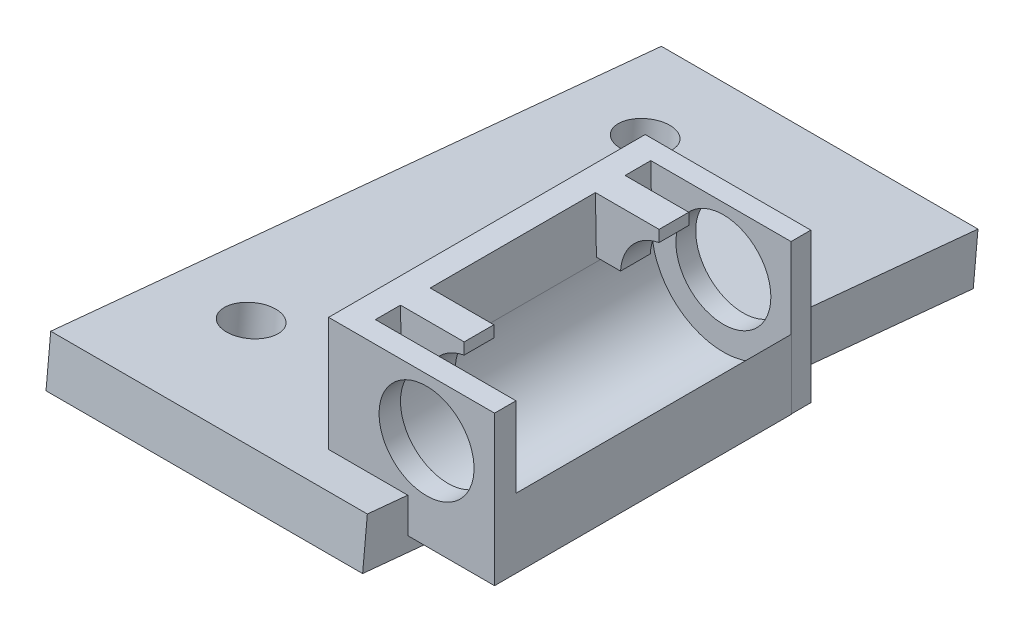
ISO-10303-21;
HEADER;
FILE_DESCRIPTION(('STEP AP214'),'2;1');
FILE_NAME('part.step','',(''),(''),'','','');
FILE_SCHEMA(('AUTOMOTIVE_DESIGN { 1 0 10303 214 1 1 1 1 }'));
ENDSEC;
DATA;
#1=APPLICATION_CONTEXT('core data for automotive mechanical design processes');
#2=APPLICATION_PROTOCOL_DEFINITION('international standard','automotive_design',2000,#1);
#3=PRODUCT_CONTEXT('',#1,'mechanical');
#4=PRODUCT('Part','Part','',(#3));
#5=PRODUCT_RELATED_PRODUCT_CATEGORY('part','',(#4));
#6=PRODUCT_DEFINITION_FORMATION('','',#4);
#7=PRODUCT_DEFINITION_CONTEXT('part definition',#1,'design');
#8=PRODUCT_DEFINITION('design','',#6,#7);
#9=PRODUCT_DEFINITION_SHAPE('','',#8);
#10=(LENGTH_UNIT() NAMED_UNIT(*) SI_UNIT(.MILLI.,.METRE.));
#11=(NAMED_UNIT(*) PLANE_ANGLE_UNIT() SI_UNIT($,.RADIAN.));
#12=(NAMED_UNIT(*) SI_UNIT($,.STERADIAN.) SOLID_ANGLE_UNIT());
#13=UNCERTAINTY_MEASURE_WITH_UNIT(LENGTH_MEASURE(1.E-05),#10,'distance_accuracy_value','');
#14=(GEOMETRIC_REPRESENTATION_CONTEXT(3) GLOBAL_UNCERTAINTY_ASSIGNED_CONTEXT((#13)) GLOBAL_UNIT_ASSIGNED_CONTEXT((#10,
#11,#12)) REPRESENTATION_CONTEXT('',''));
#15=CARTESIAN_POINT('',(0.,0.,0.));
#16=DIRECTION('',(0.,0.,1.));
#17=DIRECTION('',(1.,0.,0.));
#18=AXIS2_PLACEMENT_3D('',#15,#16,#17);
#19=CARTESIAN_POINT('',(0.,-0.379856494550895,38.1000000000001));
#20=DIRECTION('',(0.,-1.,0.));
#21=DIRECTION('',(0.,0.,1.));
#22=AXIS2_PLACEMENT_3D('',#19,#20,#21);
#23=PLANE('',#22);
#24=DIRECTION('',(1.,0.,0.));
#25=VECTOR('',#24,1.);
#26=CARTESIAN_POINT('',(-215.570198928087,-0.379856494550895,-2.54));
#27=LINE('',#26,#25);
#28=CARTESIAN_POINT('',(-205.410198928087,-0.379856494550895,-2.54));
#29=VERTEX_POINT('',#28);
#30=CARTESIAN_POINT('',(-194.315789963556,-0.379856494550895,-2.54));
#31=VERTEX_POINT('',#30);
#32=EDGE_CURVE('E384',#29,#31,#27,.T.);
#33=ORIENTED_EDGE('',*,*,#32,.T.);
#34=DIRECTION('',(0.,0.,1.));
#35=VECTOR('',#34,1.);
#36=CARTESIAN_POINT('',(-194.315789963556,-0.379856494550895,-2.54));
#37=LINE('',#36,#35);
#38=CARTESIAN_POINT('',(-194.315789963556,-0.379856494550895,0.));
#39=VERTEX_POINT('',#38);
#40=EDGE_CURVE('E406',#31,#39,#37,.T.);
#41=ORIENTED_EDGE('',*,*,#40,.T.);
#42=DIRECTION('',(1.,0.,0.));
#43=VECTOR('',#42,1.);
#44=CARTESIAN_POINT('',(0.,-0.379856494550895,0.));
#45=LINE('',#44,#43);
#46=CARTESIAN_POINT('',(-194.271100300856,-0.379856494550895,0.));
#47=VERTEX_POINT('',#46);
#48=EDGE_CURVE('E434',#39,#47,#45,.T.);
#49=ORIENTED_EDGE('',*,*,#48,.T.);
#50=DIRECTION('',(0.,0.,-1.));
#51=VECTOR('',#50,1.);
#52=CARTESIAN_POINT('',(-194.271100300856,-0.379856494550895,38.1000000000001));
#53=LINE('',#52,#51);
#54=CARTESIAN_POINT('',(-194.271100300856,-0.379856494550895,38.1000000000001));
#55=VERTEX_POINT('',#54);
#56=EDGE_CURVE('E445',#55,#47,#53,.T.);
#57=ORIENTED_EDGE('',*,*,#56,.F.);
#58=DIRECTION('',(1.,0.,0.));
#59=VECTOR('',#58,1.);
#60=CARTESIAN_POINT('',(0.,-0.379856494550895,38.1000000000001));
#61=LINE('',#60,#59);
#62=CARTESIAN_POINT('',(-205.410198928087,-0.379856494550895,38.1000000000001));
#63=VERTEX_POINT('',#62);
#64=EDGE_CURVE('E418',#63,#55,#61,.T.);
#65=ORIENTED_EDGE('',*,*,#64,.F.);
#66=DIRECTION('',(0.,0.,1.));
#67=VECTOR('',#66,1.);
#68=CARTESIAN_POINT('',(-205.410198928087,-0.379856494550895,38.1));
#69=LINE('',#68,#67);
#70=EDGE_CURVE('E251',#29,#63,#69,.T.);
#71=ORIENTED_EDGE('',*,*,#70,.F.);
#72=EDGE_LOOP('',(#33,#41,#49,#57,#65,#71));
#73=FACE_BOUND('',#72,.T.);
#74=ADVANCED_FACE('F49',(#73),#23,.T.);
#75=CARTESIAN_POINT('',(-203.,11.3497927017428,38.1000000000001));
#76=DIRECTION('',(0.,0.,-1.));
#77=DIRECTION('',(1.,0.,0.));
#78=AXIS2_PLACEMENT_3D('',#75,#76,#77);
#79=CYLINDRICAL_SURFACE('',#78,9.17500000000006);
#80=CARTESIAN_POINT('',(-203.,11.3497927017428,35.3500000000005));
#81=DIRECTION('',(0.,0.,1.));
#82=DIRECTION('',(0.,-1.,0.));
#83=AXIS2_PLACEMENT_3D('',#80,#81,#82);
#84=CIRCLE('',#83,9.17500000000006);
#85=CARTESIAN_POINT('',(-194.271100300856,8.52367610077182,35.3500000000005));
#86=VERTEX_POINT('',#85);
#87=CARTESIAN_POINT('',(-212.173440462279,11.1806327625625,35.3500000000005));
#88=VERTEX_POINT('',#87);
#89=EDGE_CURVE('E359',#86,#88,#84,.F.);
#90=ORIENTED_EDGE('',*,*,#89,.F.);
#91=DIRECTION('',(0.,0.,-1.));
#92=VECTOR('',#91,1.);
#93=CARTESIAN_POINT('',(-194.271100300856,8.52367610077182,38.1000000000001));
#94=LINE('',#93,#92);
#95=CARTESIAN_POINT('',(-194.271100300856,8.52367610077182,0.));
#96=VERTEX_POINT('',#95);
#97=EDGE_CURVE('E440',#86,#96,#94,.T.);
#98=ORIENTED_EDGE('',*,*,#97,.T.);
#99=CARTESIAN_POINT('',(-203.,11.3497927017428,0.));
#100=DIRECTION('',(0.,0.,1.));
#101=DIRECTION('',(1.,0.,0.));
#102=AXIS2_PLACEMENT_3D('',#99,#100,#101);
#103=CIRCLE('',#102,9.17500000000006);
#104=CARTESIAN_POINT('',(-194.315789963556,8.38919799072162,0.));
#105=VERTEX_POINT('',#104);
#106=EDGE_CURVE('E410',#105,#96,#103,.T.);
#107=ORIENTED_EDGE('',*,*,#106,.F.);
#108=CARTESIAN_POINT('',(-212.173440462279,11.1806327625625,0.));
#109=VERTEX_POINT('',#108);
#110=EDGE_CURVE('E427',#109,#105,#103,.T.);
#111=ORIENTED_EDGE('',*,*,#110,.F.);
#112=DIRECTION('',(0.,0.,-1.));
#113=VECTOR('',#112,1.);
#114=CARTESIAN_POINT('',(-212.173440462279,11.1806327625625,38.1000000000001));
#115=LINE('',#114,#113);
#116=EDGE_CURVE('E426',#88,#109,#115,.T.);
#117=ORIENTED_EDGE('',*,*,#116,.F.);
#118=EDGE_LOOP('',(#90,#98,#107,#111,#117));
#119=FACE_BOUND('',#118,.T.);
#120=ADVANCED_FACE('F51',(#119),#79,.F.);
#121=CARTESIAN_POINT('',(-194.271100300856,0.,38.1000000000001));
#122=DIRECTION('',(1.,0.,0.));
#123=DIRECTION('',(0.,0.,1.));
#124=AXIS2_PLACEMENT_3D('',#121,#122,#123);
#125=PLANE('',#124);
#126=DIRECTION('',(0.,1.,0.));
#127=VECTOR('',#126,1.);
#128=CARTESIAN_POINT('',(-194.271100300856,0.,0.));
#129=LINE('',#128,#127);
#130=EDGE_CURVE('E415',#47,#96,#129,.T.);
#131=ORIENTED_EDGE('',*,*,#130,.T.);
#132=ORIENTED_EDGE('',*,*,#97,.F.);
#133=DIRECTION('',(0.,-1.,0.));
#134=VECTOR('',#133,1.);
#135=CARTESIAN_POINT('',(-194.271100300856,-0.379856494550899,35.3500000000005));
#136=LINE('',#135,#134);
#137=CARTESIAN_POINT('',(-194.271100300856,18.8069348308094,35.3500000000005));
#138=VERTEX_POINT('',#137);
#139=EDGE_CURVE('E339',#138,#86,#136,.T.);
#140=ORIENTED_EDGE('',*,*,#139,.F.);
#141=DIRECTION('',(0.,0.,1.));
#142=VECTOR('',#141,1.);
#143=CARTESIAN_POINT('',(-194.271100300856,18.8069348308094,6.68321497454979));
#144=LINE('',#143,#142);
#145=CARTESIAN_POINT('',(-194.271100300856,18.8069348308094,38.1000000000001));
#146=VERTEX_POINT('',#145);
#147=EDGE_CURVE('E355',#138,#146,#144,.T.);
#148=ORIENTED_EDGE('',*,*,#147,.T.);
#149=DIRECTION('',(0.,1.,0.));
#150=VECTOR('',#149,1.);
#151=CARTESIAN_POINT('',(-194.271100300856,0.,38.1000000000001));
#152=LINE('',#151,#150);
#153=EDGE_CURVE('E422',#55,#146,#152,.T.);
#154=ORIENTED_EDGE('',*,*,#153,.F.);
#155=ORIENTED_EDGE('',*,*,#56,.T.);
#156=EDGE_LOOP('',(#131,#132,#140,#148,#154,#155));
#157=FACE_BOUND('',#156,.T.);
#158=ADVANCED_FACE('F539',(#157),#125,.T.);
#159=CARTESIAN_POINT('',(-215.570198928087,0.,38.1000000000001));
#160=DIRECTION('',(-1.,0.,0.));
#161=DIRECTION('',(0.,0.,-1.));
#162=AXIS2_PLACEMENT_3D('',#159,#160,#161);
#163=PLANE('',#162);
#164=DIRECTION('',(0.,0.0954577562183424,0.995433481844849));
#165=VECTOR('',#164,1.);
#166=CARTESIAN_POINT('',(-215.570198928087,4.08284979506725,37.7084724017005));
#167=LINE('',#166,#165);
#168=CARTESIAN_POINT('',(-215.570198928087,0.223195748106981,-2.54));
#169=VERTEX_POINT('',#168);
#170=CARTESIAN_POINT('',(-215.570198928087,4.12039559467402,38.1000000000001));
#171=VERTEX_POINT('',#170);
#172=EDGE_CURVE('E267',#169,#171,#167,.T.);
#173=ORIENTED_EDGE('',*,*,#172,.T.);
#174=DIRECTION('',(0.,-1.,0.));
#175=VECTOR('',#174,1.);
#176=CARTESIAN_POINT('',(-215.570198928087,0.,38.1000000000001));
#177=LINE('',#176,#175);
#178=CARTESIAN_POINT('',(-215.570198928087,18.8069348308094,38.1000000000001));
#179=VERTEX_POINT('',#178);
#180=EDGE_CURVE('E414',#179,#171,#177,.T.);
#181=ORIENTED_EDGE('',*,*,#180,.F.);
#182=DIRECTION('',(0.,0.,-1.));
#183=VECTOR('',#182,1.);
#184=CARTESIAN_POINT('',(-215.570198928087,18.8069348308094,38.1000000000001));
#185=LINE('',#184,#183);
#186=CARTESIAN_POINT('',(-215.570198928087,18.8069348308094,-2.54));
#187=VERTEX_POINT('',#186);
#188=EDGE_CURVE('E449',#179,#187,#185,.T.);
#189=ORIENTED_EDGE('',*,*,#188,.T.);
#190=DIRECTION('',(0.,-1.,0.));
#191=VECTOR('',#190,1.);
#192=CARTESIAN_POINT('',(-215.570198928087,-0.379856494550895,-2.54));
#193=LINE('',#192,#191);
#194=EDGE_CURVE('E380',#187,#169,#193,.T.);
#195=ORIENTED_EDGE('',*,*,#194,.T.);
#196=EDGE_LOOP('',(#173,#181,#189,#195));
#197=FACE_BOUND('',#196,.T.);
#198=ADVANCED_FACE('F557',(#197),#163,.T.);
#199=CARTESIAN_POINT('',(0.,18.8069348308094,38.1000000000001));
#200=DIRECTION('',(0.,1.,0.));
#201=DIRECTION('',(0.,0.,-1.));
#202=AXIS2_PLACEMENT_3D('',#199,#200,#201);
#203=PLANE('',#202);
#204=DIRECTION('',(0.,0.,-1.));
#205=VECTOR('',#204,1.);
#206=CARTESIAN_POINT('',(-212.314070883252,18.8069348308094,38.1000000000001));
#207=LINE('',#206,#205);
#208=CARTESIAN_POINT('',(-212.314070883252,18.8069348308094,28.3210000000001));
#209=VERTEX_POINT('',#208);
#210=CARTESIAN_POINT('',(-212.314070883252,18.8069348308094,7.112));
#211=VERTEX_POINT('',#210);
#212=EDGE_CURVE('E457',#209,#211,#207,.T.);
#213=ORIENTED_EDGE('',*,*,#212,.T.);
#214=DIRECTION('',(-1.,0.,0.));
#215=VECTOR('',#214,1.);
#216=CARTESIAN_POINT('',(-204.140198928087,18.8069348308094,7.112));
#217=LINE('',#216,#215);
#218=CARTESIAN_POINT('',(-204.140198928087,18.8069348308094,7.112));
#219=VERTEX_POINT('',#218);
#220=EDGE_CURVE('E343',#219,#211,#217,.T.);
#221=ORIENTED_EDGE('',*,*,#220,.F.);
#222=DIRECTION('',(0.,0.,1.));
#223=VECTOR('',#222,1.);
#224=CARTESIAN_POINT('',(-204.140198928087,18.8069348308094,7.112));
#225=LINE('',#224,#223);
#226=CARTESIAN_POINT('',(-204.140198928087,18.8069348308094,3.302));
#227=VERTEX_POINT('',#226);
#228=EDGE_CURVE('E327',#227,#219,#225,.T.);
#229=ORIENTED_EDGE('',*,*,#228,.F.);
#230=DIRECTION('',(-1.,0.,0.));
#231=VECTOR('',#230,1.);
#232=CARTESIAN_POINT('',(-204.140198928087,18.8069348308094,3.302));
#233=LINE('',#232,#231);
#234=CARTESIAN_POINT('',(-212.314070883252,18.8069348308094,3.302));
#235=VERTEX_POINT('',#234);
#236=EDGE_CURVE('E335',#227,#235,#233,.T.);
#237=ORIENTED_EDGE('',*,*,#236,.T.);
#238=CARTESIAN_POINT('',(-212.314070883252,18.8069348308094,0.));
#239=VERTEX_POINT('',#238);
#240=EDGE_CURVE('E458',#235,#239,#207,.T.);
#241=ORIENTED_EDGE('',*,*,#240,.T.);
#242=DIRECTION('',(-1.,0.,0.));
#243=VECTOR('',#242,1.);
#244=CARTESIAN_POINT('',(-215.570198928087,18.8069348308094,0.));
#245=LINE('',#244,#243);
#246=CARTESIAN_POINT('',(-194.315789963556,18.8069348308094,0.));
#247=VERTEX_POINT('',#246);
#248=EDGE_CURVE('E385',#247,#239,#245,.T.);
#249=ORIENTED_EDGE('',*,*,#248,.F.);
#250=DIRECTION('',(0.,0.,1.));
#251=VECTOR('',#250,1.);
#252=CARTESIAN_POINT('',(-194.315789963556,18.8069348308094,-2.54));
#253=LINE('',#252,#251);
#254=CARTESIAN_POINT('',(-194.315789963556,18.8069348308094,-2.54));
#255=VERTEX_POINT('',#254);
#256=EDGE_CURVE('E395',#255,#247,#253,.T.);
#257=ORIENTED_EDGE('',*,*,#256,.F.);
#258=DIRECTION('',(-1.,0.,0.));
#259=VECTOR('',#258,1.);
#260=CARTESIAN_POINT('',(-215.570198928087,18.8069348308094,-2.54));
#261=LINE('',#260,#259);
#262=EDGE_CURVE('E392',#255,#187,#261,.T.);
#263=ORIENTED_EDGE('',*,*,#262,.T.);
#264=ORIENTED_EDGE('',*,*,#188,.F.);
#265=DIRECTION('',(-1.,0.,0.));
#266=VECTOR('',#265,1.);
#267=CARTESIAN_POINT('',(0.,18.8069348308094,38.1000000000001));
#268=LINE('',#267,#266);
#269=EDGE_CURVE('E411',#146,#179,#268,.T.);
#270=ORIENTED_EDGE('',*,*,#269,.F.);
#271=ORIENTED_EDGE('',*,*,#147,.F.);
#272=DIRECTION('',(1.,0.,0.));
#273=VECTOR('',#272,1.);
#274=CARTESIAN_POINT('',(-194.271100300856,18.8069348308094,35.3500000000005));
#275=LINE('',#274,#273);
#276=CARTESIAN_POINT('',(-212.314070883252,18.8069348308094,35.3500000000005));
#277=VERTEX_POINT('',#276);
#278=EDGE_CURVE('E362',#277,#138,#275,.T.);
#279=ORIENTED_EDGE('',*,*,#278,.F.);
#280=CARTESIAN_POINT('',(-212.314070883252,18.8069348308094,32.131));
#281=VERTEX_POINT('',#280);
#282=EDGE_CURVE('E453',#277,#281,#207,.T.);
#283=ORIENTED_EDGE('',*,*,#282,.T.);
#284=DIRECTION('',(-1.,0.,0.));
#285=VECTOR('',#284,1.);
#286=CARTESIAN_POINT('',(-204.140198928087,18.8069348308094,32.131));
#287=LINE('',#286,#285);
#288=CARTESIAN_POINT('',(-204.140198928087,18.8069348308094,32.131));
#289=VERTEX_POINT('',#288);
#290=EDGE_CURVE('E308',#289,#281,#287,.T.);
#291=ORIENTED_EDGE('',*,*,#290,.F.);
#292=DIRECTION('',(0.,0.,1.));
#293=VECTOR('',#292,1.);
#294=CARTESIAN_POINT('',(-204.140198928087,18.8069348308094,28.3210000000001));
#295=LINE('',#294,#293);
#296=CARTESIAN_POINT('',(-204.140198928087,18.8069348308094,28.3210000000001));
#297=VERTEX_POINT('',#296);
#298=EDGE_CURVE('E317',#297,#289,#295,.T.);
#299=ORIENTED_EDGE('',*,*,#298,.F.);
#300=DIRECTION('',(-1.,0.,0.));
#301=VECTOR('',#300,1.);
#302=CARTESIAN_POINT('',(-204.140198928087,18.8069348308094,28.3210000000001));
#303=LINE('',#302,#301);
#304=EDGE_CURVE('E304',#297,#209,#303,.T.);
#305=ORIENTED_EDGE('',*,*,#304,.T.);
#306=EDGE_LOOP('',(#213,#221,#229,#237,#241,#249,#257,#263,#264,#270,#271,#279,#283,#291,#299,#305));
#307=FACE_BOUND('',#306,.T.);
#308=ADVANCED_FACE('F496',(#307),#203,.T.);
#309=CARTESIAN_POINT('',(-211.895214587435,-3.90738695672297,38.1000000000001));
#310=DIRECTION('',(0.999830023136685,0.0184370505910235,0.));
#311=DIRECTION('',(-0.0184370505910235,0.999830023136685,0.));
#312=AXIS2_PLACEMENT_3D('',#309,#310,#311);
#313=PLANE('',#312);
#314=DIRECTION('',(-0.0184370505910235,0.999830023136685,0.));
#315=VECTOR('',#314,1.);
#316=CARTESIAN_POINT('',(-211.895214587435,-3.90738695672298,32.1310000000001));
#317=LINE('',#316,#315);
#318=CARTESIAN_POINT('',(-212.182924287561,11.6949348308094,32.1310000000001));
#319=VERTEX_POINT('',#318);
#320=EDGE_CURVE('E58',#319,#281,#317,.T.);
#321=ORIENTED_EDGE('',*,*,#320,.T.);
#322=ORIENTED_EDGE('',*,*,#282,.F.);
#323=DIRECTION('',(0.0184370505910235,-0.999830023136685,0.));
#324=VECTOR('',#323,1.);
#325=CARTESIAN_POINT('',(-211.895214587435,-3.90738695672297,35.3500000000005));
#326=LINE('',#325,#324);
#327=EDGE_CURVE('E444',#277,#88,#326,.T.);
#328=ORIENTED_EDGE('',*,*,#327,.T.);
#329=ORIENTED_EDGE('',*,*,#116,.T.);
#330=DIRECTION('',(-0.0184370505910235,0.999830023136685,0.));
#331=VECTOR('',#330,1.);
#332=CARTESIAN_POINT('',(-211.895214587435,-3.90738695672297,0.));
#333=LINE('',#332,#331);
#334=EDGE_CURVE('E431',#109,#239,#333,.T.);
#335=ORIENTED_EDGE('',*,*,#334,.T.);
#336=ORIENTED_EDGE('',*,*,#240,.F.);
#337=DIRECTION('',(0.0184370505910235,-0.999830023136685,0.));
#338=VECTOR('',#337,1.);
#339=CARTESIAN_POINT('',(-211.895214587435,-3.90738695672297,3.302));
#340=LINE('',#339,#338);
#341=CARTESIAN_POINT('',(-212.182924287561,11.6949348308094,3.302));
#342=VERTEX_POINT('',#341);
#343=EDGE_CURVE('E471',#235,#342,#340,.T.);
#344=ORIENTED_EDGE('',*,*,#343,.T.);
#345=DIRECTION('',(0.,0.,1.));
#346=VECTOR('',#345,1.);
#347=CARTESIAN_POINT('',(-212.182924287561,11.6949348308094,38.1000000000001));
#348=LINE('',#347,#346);
#349=CARTESIAN_POINT('',(-212.182924287561,11.6949348308094,7.112));
#350=VERTEX_POINT('',#349);
#351=EDGE_CURVE('E467',#342,#350,#348,.T.);
#352=ORIENTED_EDGE('',*,*,#351,.T.);
#353=DIRECTION('',(-0.0184370505910235,0.999830023136685,0.));
#354=VECTOR('',#353,1.);
#355=CARTESIAN_POINT('',(-211.895214587435,-3.90738695672297,7.112));
#356=LINE('',#355,#354);
#357=EDGE_CURVE('E464',#350,#211,#356,.T.);
#358=ORIENTED_EDGE('',*,*,#357,.T.);
#359=ORIENTED_EDGE('',*,*,#212,.F.);
#360=DIRECTION('',(0.0184370505910235,-0.999830023136685,0.));
#361=VECTOR('',#360,1.);
#362=CARTESIAN_POINT('',(-211.895214587435,-3.90738695672297,28.3210000000001));
#363=LINE('',#362,#361);
#364=CARTESIAN_POINT('',(-212.182924287561,11.6949348308094,28.3210000000001));
#365=VERTEX_POINT('',#364);
#366=EDGE_CURVE('E475',#209,#365,#363,.T.);
#367=ORIENTED_EDGE('',*,*,#366,.T.);
#368=DIRECTION('',(0.,0.,1.));
#369=VECTOR('',#368,1.);
#370=CARTESIAN_POINT('',(-212.182924287561,11.6949348308094,38.1000000000001));
#371=LINE('',#370,#369);
#372=EDGE_CURVE('E479',#365,#319,#371,.T.);
#373=ORIENTED_EDGE('',*,*,#372,.T.);
#374=EDGE_LOOP('',(#321,#322,#328,#329,#335,#336,#344,#352,#358,#359,#367,#373));
#375=FACE_BOUND('',#374,.T.);
#376=ADVANCED_FACE('F486',(#375),#313,.T.);
#377=CARTESIAN_POINT('',(0.,0.,38.1000000000001));
#378=DIRECTION('',(0.,0.,-1.));
#379=DIRECTION('',(1.,0.,0.));
#380=AXIS2_PLACEMENT_3D('',#377,#378,#379);
#381=PLANE('',#380);
#382=DIRECTION('',(0.,-1.,0.));
#383=VECTOR('',#382,1.);
#384=CARTESIAN_POINT('',(-205.410198928087,1.48699544305696E-13,38.1000000000001));
#385=LINE('',#384,#383);
#386=CARTESIAN_POINT('',(-205.410198928087,4.12039559467402,38.1000000000001));
#387=VERTEX_POINT('',#386);
#388=EDGE_CURVE('E260',#387,#63,#385,.T.);
#389=ORIENTED_EDGE('',*,*,#388,.T.);
#390=ORIENTED_EDGE('',*,*,#64,.T.);
#391=ORIENTED_EDGE('',*,*,#153,.T.);
#392=ORIENTED_EDGE('',*,*,#269,.T.);
#393=ORIENTED_EDGE('',*,*,#180,.T.);
#394=DIRECTION('',(-1.,0.,0.));
#395=VECTOR('',#394,1.);
#396=CARTESIAN_POINT('',(0.,4.12039559467387,38.1000000000001));
#397=LINE('',#396,#395);
#398=EDGE_CURVE('E69',#387,#171,#397,.T.);
#399=ORIENTED_EDGE('',*,*,#398,.F.);
#400=EDGE_LOOP('',(#389,#390,#391,#392,#393,#399));
#401=FACE_BOUND('',#400,.T.);
#402=CARTESIAN_POINT('',(-203.,11.3497927017428,38.1000000000001));
#403=DIRECTION('',(0.,0.,-1.));
#404=DIRECTION('',(-1.,0.,0.));
#405=AXIS2_PLACEMENT_3D('',#402,#403,#404);
#406=CIRCLE('',#405,6.09599999999999);
#407=CARTESIAN_POINT('',(-209.096,11.3497927017428,38.1000000000001));
#408=VERTEX_POINT('',#407);
#409=EDGE_CURVE('E350',#408,#408,#406,.T.);
#410=ORIENTED_EDGE('',*,*,#409,.T.);
#411=EDGE_LOOP('',(#410));
#412=FACE_BOUND('',#411,.T.);
#413=ADVANCED_FACE('F559',(#401,#412),#381,.F.);
#414=CARTESIAN_POINT('',(0.,0.,0.));
#415=DIRECTION('',(0.,0.,-1.));
#416=DIRECTION('',(1.,0.,0.));
#417=AXIS2_PLACEMENT_3D('',#414,#415,#416);
#418=PLANE('',#417);
#419=DIRECTION('',(0.,1.,0.));
#420=VECTOR('',#419,1.);
#421=CARTESIAN_POINT('',(-194.315789963556,-0.379856494550895,0.));
#422=LINE('',#421,#420);
#423=EDGE_CURVE('E396',#39,#105,#422,.T.);
#424=ORIENTED_EDGE('',*,*,#423,.T.);
#425=ORIENTED_EDGE('',*,*,#106,.T.);
#426=ORIENTED_EDGE('',*,*,#130,.F.);
#427=ORIENTED_EDGE('',*,*,#48,.F.);
#428=EDGE_LOOP('',(#424,#425,#426,#427));
#429=FACE_BOUND('',#428,.T.);
#430=ADVANCED_FACE('F536',(#429),#418,.T.);
#431=CARTESIAN_POINT('',(0.,0.,0.));
#432=DIRECTION('',(0.,0.,1.));
#433=DIRECTION('',(-1.,0.,0.));
#434=AXIS2_PLACEMENT_3D('',#431,#432,#433);
#435=PLANE('',#434);
#436=CARTESIAN_POINT('',(-203.,11.3497927017428,0.));
#437=DIRECTION('',(0.,0.,1.));
#438=DIRECTION('',(1.,0.,0.));
#439=AXIS2_PLACEMENT_3D('',#436,#437,#438);
#440=CIRCLE('',#439,6.09599999999999);
#441=CARTESIAN_POINT('',(-196.904,11.3497927017428,0.));
#442=VERTEX_POINT('',#441);
#443=EDGE_CURVE('E371',#442,#442,#440,.T.);
#444=ORIENTED_EDGE('',*,*,#443,.F.);
#445=EDGE_LOOP('',(#444));
#446=FACE_BOUND('',#445,.T.);
#447=ORIENTED_EDGE('',*,*,#110,.T.);
#448=EDGE_CURVE('E376',#105,#247,#422,.T.);
#449=ORIENTED_EDGE('',*,*,#448,.T.);
#450=ORIENTED_EDGE('',*,*,#248,.T.);
#451=ORIENTED_EDGE('',*,*,#334,.F.);
#452=EDGE_LOOP('',(#447,#449,#450,#451));
#453=FACE_BOUND('',#452,.T.);
#454=ADVANCED_FACE('F510',(#446,#453),#435,.T.);
#455=CARTESIAN_POINT('',(0.,0.,-2.54));
#456=DIRECTION('',(0.,0.,1.));
#457=DIRECTION('',(-1.,0.,0.));
#458=AXIS2_PLACEMENT_3D('',#455,#456,#457);
#459=PLANE('',#458);
#460=ORIENTED_EDGE('',*,*,#194,.F.);
#461=ORIENTED_EDGE('',*,*,#262,.F.);
#462=DIRECTION('',(0.,1.,0.));
#463=VECTOR('',#462,1.);
#464=CARTESIAN_POINT('',(-194.315789963556,-0.379856494550895,-2.54));
#465=LINE('',#464,#463);
#466=EDGE_CURVE('E389',#31,#255,#465,.T.);
#467=ORIENTED_EDGE('',*,*,#466,.F.);
#468=ORIENTED_EDGE('',*,*,#32,.F.);
#469=DIRECTION('',(0.,1.,0.));
#470=VECTOR('',#469,1.);
#471=CARTESIAN_POINT('',(-205.410198928087,1.48699544305696E-13,-2.54));
#472=LINE('',#471,#470);
#473=CARTESIAN_POINT('',(-205.410198928087,0.223195748106979,-2.54));
#474=VERTEX_POINT('',#473);
#475=EDGE_CURVE('E246',#29,#474,#472,.T.);
#476=ORIENTED_EDGE('',*,*,#475,.T.);
#477=DIRECTION('',(1.,0.,0.));
#478=VECTOR('',#477,1.);
#479=CARTESIAN_POINT('',(0.,0.223195748106828,-2.54));
#480=LINE('',#479,#478);
#481=EDGE_CURVE('E263',#169,#474,#480,.T.);
#482=ORIENTED_EDGE('',*,*,#481,.F.);
#483=EDGE_LOOP('',(#460,#461,#467,#468,#476,#482));
#484=FACE_BOUND('',#483,.T.);
#485=CARTESIAN_POINT('',(-203.,11.3497927017428,-2.54));
#486=DIRECTION('',(0.,0.,1.));
#487=DIRECTION('',(1.,0.,0.));
#488=AXIS2_PLACEMENT_3D('',#485,#486,#487);
#489=CIRCLE('',#488,6.09599999999999);
#490=CARTESIAN_POINT('',(-196.904,11.3497927017428,-2.54));
#491=VERTEX_POINT('',#490);
#492=EDGE_CURVE('E372',#491,#491,#489,.T.);
#493=ORIENTED_EDGE('',*,*,#492,.T.);
#494=EDGE_LOOP('',(#493));
#495=FACE_BOUND('',#494,.T.);
#496=ADVANCED_FACE('F554',(#484,#495),#459,.F.);
#497=CARTESIAN_POINT('',(-194.315789963556,-0.379856494550895,-2.54));
#498=DIRECTION('',(-1.,0.,0.));
#499=DIRECTION('',(0.,0.,-1.));
#500=AXIS2_PLACEMENT_3D('',#497,#498,#499);
#501=PLANE('',#500);
#502=ORIENTED_EDGE('',*,*,#423,.F.);
#503=ORIENTED_EDGE('',*,*,#40,.F.);
#504=ORIENTED_EDGE('',*,*,#466,.T.);
#505=ORIENTED_EDGE('',*,*,#256,.T.);
#506=ORIENTED_EDGE('',*,*,#448,.F.);
#507=EDGE_LOOP('',(#502,#503,#504,#505,#506));
#508=FACE_BOUND('',#507,.T.);
#509=ADVANCED_FACE('F547',(#508),#501,.F.);
#510=CARTESIAN_POINT('',(-203.,11.3497927017428,-2.54));
#511=DIRECTION('',(0.,0.,1.));
#512=DIRECTION('',(-1.,0.,0.));
#513=AXIS2_PLACEMENT_3D('',#510,#511,#512);
#514=CYLINDRICAL_SURFACE('',#513,6.09599999999999);
#515=ORIENTED_EDGE('',*,*,#492,.F.);
#516=EDGE_LOOP('',(#515));
#517=FACE_BOUND('',#516,.T.);
#518=ORIENTED_EDGE('',*,*,#443,.T.);
#519=EDGE_LOOP('',(#518));
#520=FACE_BOUND('',#519,.T.);
#521=ADVANCED_FACE('F608',(#517,#520),#514,.F.);
#522=CARTESIAN_POINT('',(0.,0.,35.3500000000005));
#523=DIRECTION('',(0.,0.,-1.));
#524=DIRECTION('',(1.,0.,0.));
#525=AXIS2_PLACEMENT_3D('',#522,#523,#524);
#526=PLANE('',#525);
#527=ORIENTED_EDGE('',*,*,#89,.T.);
#528=ORIENTED_EDGE('',*,*,#327,.F.);
#529=ORIENTED_EDGE('',*,*,#278,.T.);
#530=ORIENTED_EDGE('',*,*,#139,.T.);
#531=EDGE_LOOP('',(#527,#528,#529,#530));
#532=FACE_BOUND('',#531,.T.);
#533=CARTESIAN_POINT('',(-203.,11.3497927017428,35.3500000000005));
#534=DIRECTION('',(0.,0.,1.));
#535=DIRECTION('',(0.,-1.,0.));
#536=AXIS2_PLACEMENT_3D('',#533,#534,#535);
#537=CIRCLE('',#536,6.09599999999999);
#538=CARTESIAN_POINT('',(-203.,5.25379270174281,35.3500000000005));
#539=VERTEX_POINT('',#538);
#540=EDGE_CURVE('E354',#539,#539,#537,.F.);
#541=ORIENTED_EDGE('',*,*,#540,.F.);
#542=EDGE_LOOP('',(#541));
#543=FACE_BOUND('',#542,.T.);
#544=ADVANCED_FACE('F500',(#532,#543),#526,.T.);
#545=CARTESIAN_POINT('',(-203.,11.3497927017428,6.68321497454979));
#546=DIRECTION('',(0.,0.,1.));
#547=DIRECTION('',(-1.,0.,0.));
#548=AXIS2_PLACEMENT_3D('',#545,#546,#547);
#549=CYLINDRICAL_SURFACE('',#548,6.09599999999999);
#550=ORIENTED_EDGE('',*,*,#409,.F.);
#551=EDGE_LOOP('',(#550));
#552=FACE_BOUND('',#551,.T.);
#553=ORIENTED_EDGE('',*,*,#540,.T.);
#554=EDGE_LOOP('',(#553));
#555=FACE_BOUND('',#554,.T.);
#556=ADVANCED_FACE('F619',(#552,#555),#549,.F.);
#557=CARTESIAN_POINT('',(-204.140198928087,18.8069348308094,3.302));
#558=DIRECTION('',(0.,0.,-1.));
#559=DIRECTION('',(0.,-1.,0.));
#560=AXIS2_PLACEMENT_3D('',#557,#558,#559);
#561=PLANE('',#560);
#562=CARTESIAN_POINT('',(-203.,11.3497927017428,3.302));
#563=DIRECTION('',(0.,0.,1.));
#564=DIRECTION('',(0.,-1.,0.));
#565=AXIS2_PLACEMENT_3D('',#562,#563,#564);
#566=CIRCLE('',#565,6.09599999999999);
#567=CARTESIAN_POINT('',(-204.140198928087,17.3382117255245,3.302));
#568=VERTEX_POINT('',#567);
#569=CARTESIAN_POINT('',(-209.086221562739,11.6949348308093,3.302));
#570=VERTEX_POINT('',#569);
#571=EDGE_CURVE('E295',#568,#570,#566,.T.);
#572=ORIENTED_EDGE('',*,*,#571,.T.);
#573=DIRECTION('',(-1.,0.,0.));
#574=VECTOR('',#573,1.);
#575=CARTESIAN_POINT('',(-204.140198928087,11.6949348308094,3.302));
#576=LINE('',#575,#574);
#577=EDGE_CURVE('E336',#570,#342,#576,.T.);
#578=ORIENTED_EDGE('',*,*,#577,.T.);
#579=ORIENTED_EDGE('',*,*,#343,.F.);
#580=ORIENTED_EDGE('',*,*,#236,.F.);
#581=DIRECTION('',(0.,1.,0.));
#582=VECTOR('',#581,1.);
#583=CARTESIAN_POINT('',(-204.140198928087,18.8069348308094,3.302));
#584=LINE('',#583,#582);
#585=EDGE_CURVE('E324',#568,#227,#584,.T.);
#586=ORIENTED_EDGE('',*,*,#585,.F.);
#587=EDGE_LOOP('',(#572,#578,#579,#580,#586));
#588=FACE_BOUND('',#587,.T.);
#589=ADVANCED_FACE('F520',(#588),#561,.T.);
#590=CARTESIAN_POINT('',(-204.140198928087,11.6949348308094,3.302));
#591=DIRECTION('',(0.,-1.,0.));
#592=DIRECTION('',(0.,0.,1.));
#593=AXIS2_PLACEMENT_3D('',#590,#591,#592);
#594=PLANE('',#593);
#595=DIRECTION('',(0.,0.,-1.));
#596=VECTOR('',#595,1.);
#597=CARTESIAN_POINT('',(-209.086221562739,11.6949348308093,45.466));
#598=LINE('',#597,#596);
#599=CARTESIAN_POINT('',(-209.086221562739,11.6949348308094,7.112));
#600=VERTEX_POINT('',#599);
#601=EDGE_CURVE('E291',#570,#600,#598,.F.);
#602=ORIENTED_EDGE('',*,*,#601,.T.);
#603=DIRECTION('',(-1.,0.,0.));
#604=VECTOR('',#603,1.);
#605=CARTESIAN_POINT('',(-204.140198928087,11.6949348308094,7.112));
#606=LINE('',#605,#604);
#607=EDGE_CURVE('E340',#600,#350,#606,.T.);
#608=ORIENTED_EDGE('',*,*,#607,.T.);
#609=ORIENTED_EDGE('',*,*,#351,.F.);
#610=ORIENTED_EDGE('',*,*,#577,.F.);
#611=EDGE_LOOP('',(#602,#608,#609,#610));
#612=FACE_BOUND('',#611,.T.);
#613=ADVANCED_FACE('F525',(#612),#594,.T.);
#614=CARTESIAN_POINT('',(-204.140198928087,11.6949348308094,7.112));
#615=DIRECTION('',(0.,0.,1.));
#616=DIRECTION('',(-1.,0.,0.));
#617=AXIS2_PLACEMENT_3D('',#614,#615,#616);
#618=PLANE('',#617);
#619=CARTESIAN_POINT('',(-203.,11.3497927017428,7.112));
#620=DIRECTION('',(0.,0.,-1.));
#621=DIRECTION('',(-1.,0.,0.));
#622=AXIS2_PLACEMENT_3D('',#619,#620,#621);
#623=CIRCLE('',#622,6.09599999999999);
#624=CARTESIAN_POINT('',(-204.140198928087,17.3382117255245,7.112));
#625=VERTEX_POINT('',#624);
#626=EDGE_CURVE('E287',#600,#625,#623,.T.);
#627=ORIENTED_EDGE('',*,*,#626,.T.);
#628=DIRECTION('',(0.,-1.,0.));
#629=VECTOR('',#628,1.);
#630=CARTESIAN_POINT('',(-204.140198928087,11.6949348308094,7.112));
#631=LINE('',#630,#629);
#632=EDGE_CURVE('E331',#219,#625,#631,.T.);
#633=ORIENTED_EDGE('',*,*,#632,.F.);
#634=ORIENTED_EDGE('',*,*,#220,.T.);
#635=ORIENTED_EDGE('',*,*,#357,.F.);
#636=ORIENTED_EDGE('',*,*,#607,.F.);
#637=EDGE_LOOP('',(#627,#633,#634,#635,#636));
#638=FACE_BOUND('',#637,.T.);
#639=ADVANCED_FACE('F530',(#638),#618,.T.);
#640=CARTESIAN_POINT('',(-204.140198928087,0.,0.));
#641=DIRECTION('',(1.,0.,0.));
#642=DIRECTION('',(0.,0.,1.));
#643=AXIS2_PLACEMENT_3D('',#640,#641,#642);
#644=PLANE('',#643);
#645=DIRECTION('',(0.,0.,-1.));
#646=VECTOR('',#645,1.);
#647=CARTESIAN_POINT('',(-204.140198928087,17.3382117255245,45.466));
#648=LINE('',#647,#646);
#649=EDGE_CURVE('E284',#625,#568,#648,.T.);
#650=ORIENTED_EDGE('',*,*,#649,.T.);
#651=ORIENTED_EDGE('',*,*,#585,.T.);
#652=ORIENTED_EDGE('',*,*,#228,.T.);
#653=ORIENTED_EDGE('',*,*,#632,.T.);
#654=EDGE_LOOP('',(#650,#651,#652,#653));
#655=FACE_BOUND('',#654,.T.);
#656=ADVANCED_FACE('F627',(#655),#644,.T.);
#657=CARTESIAN_POINT('',(-204.140198928087,11.6949348308094,32.1310000000001));
#658=DIRECTION('',(0.,-1.,0.));
#659=DIRECTION('',(0.,0.,1.));
#660=AXIS2_PLACEMENT_3D('',#657,#658,#659);
#661=PLANE('',#660);
#662=DIRECTION('',(0.,0.,-1.));
#663=VECTOR('',#662,1.);
#664=CARTESIAN_POINT('',(-209.086221562739,11.6949348308094,45.466));
#665=LINE('',#664,#663);
#666=CARTESIAN_POINT('',(-209.086221562739,11.6949348308094,28.3210000000001));
#667=VERTEX_POINT('',#666);
#668=CARTESIAN_POINT('',(-209.086221562739,11.6949348308094,32.1310000000001));
#669=VERTEX_POINT('',#668);
#670=EDGE_CURVE('E280',#667,#669,#665,.F.);
#671=ORIENTED_EDGE('',*,*,#670,.T.);
#672=DIRECTION('',(-1.,0.,0.));
#673=VECTOR('',#672,1.);
#674=CARTESIAN_POINT('',(-204.140198928087,11.6949348308094,32.1310000000001));
#675=LINE('',#674,#673);
#676=EDGE_CURVE('E299',#669,#319,#675,.T.);
#677=ORIENTED_EDGE('',*,*,#676,.T.);
#678=ORIENTED_EDGE('',*,*,#372,.F.);
#679=DIRECTION('',(-1.,0.,0.));
#680=VECTOR('',#679,1.);
#681=CARTESIAN_POINT('',(-204.140198928087,11.6949348308094,28.3210000000001));
#682=LINE('',#681,#680);
#683=EDGE_CURVE('E300',#667,#365,#682,.T.);
#684=ORIENTED_EDGE('',*,*,#683,.F.);
#685=EDGE_LOOP('',(#671,#677,#678,#684));
#686=FACE_BOUND('',#685,.T.);
#687=ADVANCED_FACE('F632',(#686),#661,.T.);
#688=CARTESIAN_POINT('',(-204.140198928087,18.8069348308094,32.131));
#689=DIRECTION('',(0.,0.,1.));
#690=DIRECTION('',(0.,1.,0.));
#691=AXIS2_PLACEMENT_3D('',#688,#689,#690);
#692=PLANE('',#691);
#693=CARTESIAN_POINT('',(-203.,11.3497927017428,32.1310000000001));
#694=DIRECTION('',(0.,0.,-1.));
#695=DIRECTION('',(0.,1.,0.));
#696=AXIS2_PLACEMENT_3D('',#693,#694,#695);
#697=CIRCLE('',#696,6.09599999999999);
#698=CARTESIAN_POINT('',(-204.140198928087,17.3382117255245,32.131));
#699=VERTEX_POINT('',#698);
#700=EDGE_CURVE('E276',#669,#699,#697,.T.);
#701=ORIENTED_EDGE('',*,*,#700,.T.);
#702=DIRECTION('',(0.,-1.,0.));
#703=VECTOR('',#702,1.);
#704=CARTESIAN_POINT('',(-204.140198928087,18.8069348308094,32.131));
#705=LINE('',#704,#703);
#706=EDGE_CURVE('E303',#289,#699,#705,.T.);
#707=ORIENTED_EDGE('',*,*,#706,.F.);
#708=ORIENTED_EDGE('',*,*,#290,.T.);
#709=ORIENTED_EDGE('',*,*,#320,.F.);
#710=ORIENTED_EDGE('',*,*,#676,.F.);
#711=EDGE_LOOP('',(#701,#707,#708,#709,#710));
#712=FACE_BOUND('',#711,.T.);
#713=ADVANCED_FACE('F492',(#712),#692,.T.);
#714=CARTESIAN_POINT('',(-204.140198928087,11.6949348308094,28.3210000000001));
#715=DIRECTION('',(0.,0.,-1.));
#716=DIRECTION('',(1.,0.,0.));
#717=AXIS2_PLACEMENT_3D('',#714,#715,#716);
#718=PLANE('',#717);
#719=CARTESIAN_POINT('',(-203.,11.3497927017428,28.3210000000001));
#720=DIRECTION('',(0.,0.,1.));
#721=DIRECTION('',(1.,0.,0.));
#722=AXIS2_PLACEMENT_3D('',#719,#720,#721);
#723=CIRCLE('',#722,6.09599999999999);
#724=CARTESIAN_POINT('',(-204.140198928087,17.3382117255245,28.3210000000001));
#725=VERTEX_POINT('',#724);
#726=EDGE_CURVE('E273',#725,#667,#723,.T.);
#727=ORIENTED_EDGE('',*,*,#726,.T.);
#728=ORIENTED_EDGE('',*,*,#683,.T.);
#729=ORIENTED_EDGE('',*,*,#366,.F.);
#730=ORIENTED_EDGE('',*,*,#304,.F.);
#731=DIRECTION('',(0.,1.,0.));
#732=VECTOR('',#731,1.);
#733=CARTESIAN_POINT('',(-204.140198928087,11.6949348308094,28.3210000000001));
#734=LINE('',#733,#732);
#735=EDGE_CURVE('E321',#725,#297,#734,.T.);
#736=ORIENTED_EDGE('',*,*,#735,.F.);
#737=EDGE_LOOP('',(#727,#728,#729,#730,#736));
#738=FACE_BOUND('',#737,.T.);
#739=ADVANCED_FACE('F637',(#738),#718,.T.);
#740=CARTESIAN_POINT('',(-204.140198928087,0.,0.));
#741=DIRECTION('',(-1.,0.,0.));
#742=DIRECTION('',(0.,0.,-1.));
#743=AXIS2_PLACEMENT_3D('',#740,#741,#742);
#744=PLANE('',#743);
#745=ORIENTED_EDGE('',*,*,#735,.T.);
#746=ORIENTED_EDGE('',*,*,#298,.T.);
#747=ORIENTED_EDGE('',*,*,#706,.T.);
#748=DIRECTION('',(0.,0.,-1.));
#749=VECTOR('',#748,1.);
#750=CARTESIAN_POINT('',(-204.140198928087,17.3382117255245,45.466));
#751=LINE('',#750,#749);
#752=EDGE_CURVE('E11',#725,#699,#751,.F.);
#753=ORIENTED_EDGE('',*,*,#752,.F.);
#754=EDGE_LOOP('',(#745,#746,#747,#753));
#755=FACE_BOUND('',#754,.T.);
#756=ADVANCED_FACE('F634',(#755),#744,.F.);
#757=CARTESIAN_POINT('',(-203.,11.3497927017428,45.466));
#758=DIRECTION('',(0.,0.,-1.));
#759=DIRECTION('',(1.,0.,0.));
#760=AXIS2_PLACEMENT_3D('',#757,#758,#759);
#761=CYLINDRICAL_SURFACE('',#760,6.09599999999999);
#762=ORIENTED_EDGE('',*,*,#670,.F.);
#763=ORIENTED_EDGE('',*,*,#726,.F.);
#764=ORIENTED_EDGE('',*,*,#752,.T.);
#765=ORIENTED_EDGE('',*,*,#700,.F.);
#766=EDGE_LOOP('',(#762,#763,#764,#765));
#767=FACE_BOUND('',#766,.T.);
#768=ADVANCED_FACE('F579',(#767),#761,.F.);
#769=ORIENTED_EDGE('',*,*,#571,.F.);
#770=ORIENTED_EDGE('',*,*,#649,.F.);
#771=ORIENTED_EDGE('',*,*,#626,.F.);
#772=ORIENTED_EDGE('',*,*,#601,.F.);
#773=EDGE_LOOP('',(#769,#770,#771,#772));
#774=FACE_BOUND('',#773,.T.);
#775=ADVANCED_FACE('F571',(#774),#761,.F.);
#776=CARTESIAN_POINT('',(0.,0.462517438025118,-0.0443534175321376));
#777=DIRECTION('',(0.,0.995433481844849,-0.0954577562183424));
#778=DIRECTION('',(0.,-0.0954577562183424,-0.995433481844849));
#779=AXIS2_PLACEMENT_3D('',#776,#777,#778);
#780=PLANE('',#779);
#781=CARTESIAN_POINT('',(-235.857142857137,-1.72099224172057,-22.8139923579213));
#782=DIRECTION('',(0.,-0.995433481844849,0.0954577562183425));
#783=DIRECTION('',(0.,-0.0954577562183425,-0.995433481844849));
#784=AXIS2_PLACEMENT_3D('',#781,#782,#783);
#785=CIRCLE('',#784,3.175);
#786=CARTESIAN_POINT('',(-235.857142857137,-2.02407061771381,-25.9744936627787));
#787=VERTEX_POINT('',#786);
#788=EDGE_CURVE('E680',#787,#787,#785,.T.);
#789=ORIENTED_EDGE('',*,*,#788,.T.);
#790=EDGE_LOOP('',(#789));
#791=FACE_BOUND('',#790,.T.);
#792=CARTESIAN_POINT('',(-235.857142857138,3.12826177417123,27.754028519797));
#793=DIRECTION('',(0.,-0.995433481844849,0.0954577562183425));
#794=DIRECTION('',(0.,-0.0954577562183425,-0.995433481844849));
#795=AXIS2_PLACEMENT_3D('',#792,#793,#794);
#796=CIRCLE('',#795,3.17500000000003);
#797=CARTESIAN_POINT('',(-235.857142857138,2.82518339817799,24.5935272149396));
#798=VERTEX_POINT('',#797);
#799=EDGE_CURVE('E676',#798,#798,#796,.T.);
#800=ORIENTED_EDGE('',*,*,#799,.T.);
#801=EDGE_LOOP('',(#800));
#802=FACE_BOUND('',#801,.T.);
#803=ORIENTED_EDGE('',*,*,#398,.T.);
#804=ORIENTED_EDGE('',*,*,#172,.F.);
#805=ORIENTED_EDGE('',*,*,#481,.T.);
#806=DIRECTION('',(0.,0.0954577562183424,0.995433481844849));
#807=VECTOR('',#806,1.);
#808=CARTESIAN_POINT('',(-205.410198928087,4.61791608228619,43.2881436448197));
#809=LINE('',#808,#807);
#810=CARTESIAN_POINT('',(-205.410198928087,-2.89842764234609,-35.0922887156437));
#811=VERTEX_POINT('',#810);
#812=EDGE_CURVE('E565',#811,#474,#809,.T.);
#813=ORIENTED_EDGE('',*,*,#812,.F.);
#814=DIRECTION('',(1.,0.,0.));
#815=VECTOR('',#814,1.);
#816=CARTESIAN_POINT('',(-246.050198928087,-2.89842764234606,-35.0922887156437));
#817=LINE('',#816,#815);
#818=CARTESIAN_POINT('',(-246.050198928087,-2.89842764234606,-35.0922887156437));
#819=VERTEX_POINT('',#818);
#820=EDGE_CURVE('E666',#819,#811,#817,.T.);
#821=ORIENTED_EDGE('',*,*,#820,.F.);
#822=DIRECTION('',(0.,-0.0954577562183424,-0.995433481844849));
#823=VECTOR('',#822,1.);
#824=CARTESIAN_POINT('',(-246.050198928087,4.61791608228622,43.2881436448197));
#825=LINE('',#824,#823);
#826=CARTESIAN_POINT('',(-246.050198928087,4.61791608228622,43.2881436448197));
#827=VERTEX_POINT('',#826);
#828=EDGE_CURVE('E243',#827,#819,#825,.T.);
#829=ORIENTED_EDGE('',*,*,#828,.F.);
#830=DIRECTION('',(-1.,0.,0.));
#831=VECTOR('',#830,1.);
#832=CARTESIAN_POINT('',(-246.050198928087,4.61791608228622,43.2881436448197));
#833=LINE('',#832,#831);
#834=CARTESIAN_POINT('',(-205.410198928087,4.61791608228619,43.2881436448197));
#835=VERTEX_POINT('',#834);
#836=EDGE_CURVE('E567',#835,#827,#833,.T.);
#837=ORIENTED_EDGE('',*,*,#836,.F.);
#838=EDGE_CURVE('E65',#387,#835,#809,.T.);
#839=ORIENTED_EDGE('',*,*,#838,.F.);
#840=EDGE_LOOP('',(#803,#804,#805,#813,#821,#829,#837,#839));
#841=FACE_BOUND('',#840,.T.);
#842=ADVANCED_FACE('F569',(#791,#802,#841),#780,.T.);
#843=CARTESIAN_POINT('',(-205.410198928087,4.61791608228619,43.2881436448197));
#844=DIRECTION('',(-1.,0.,0.));
#845=DIRECTION('',(0.,-1.,0.));
#846=AXIS2_PLACEMENT_3D('',#843,#844,#845);
#847=PLANE('',#846);
#848=ORIENTED_EDGE('',*,*,#838,.T.);
#849=DIRECTION('',(0.,-0.995433481844849,0.0954577562183425));
#850=VECTOR('',#849,1.);
#851=CARTESIAN_POINT('',(-205.410198928087,4.61791608228619,43.2881436448197));
#852=LINE('',#851,#850);
#853=CARTESIAN_POINT('',(-205.410198928087,-1.7030865274286,43.8943003968061));
#854=VERTEX_POINT('',#853);
#855=EDGE_CURVE('E253',#835,#854,#852,.T.);
#856=ORIENTED_EDGE('',*,*,#855,.T.);
#857=DIRECTION('',(0.,0.0954577562183424,0.995433481844849));
#858=VECTOR('',#857,1.);
#859=CARTESIAN_POINT('',(-205.410198928087,-1.7030865274286,43.8943003968061));
#860=LINE('',#859,#858);
#861=CARTESIAN_POINT('',(-205.410198928087,-9.21943025206088,-34.4861319636573));
#862=VERTEX_POINT('',#861);
#863=EDGE_CURVE('E230',#862,#854,#860,.T.);
#864=ORIENTED_EDGE('',*,*,#863,.F.);
#865=DIRECTION('',(0.,-0.995433481844849,0.0954577562183425));
#866=VECTOR('',#865,1.);
#867=CARTESIAN_POINT('',(-205.410198928087,-2.89842764234609,-35.0922887156437));
#868=LINE('',#867,#866);
#869=EDGE_CURVE('E225',#811,#862,#868,.T.);
#870=ORIENTED_EDGE('',*,*,#869,.F.);
#871=ORIENTED_EDGE('',*,*,#812,.T.);
#872=ORIENTED_EDGE('',*,*,#475,.F.);
#873=ORIENTED_EDGE('',*,*,#70,.T.);
#874=ORIENTED_EDGE('',*,*,#388,.F.);
#875=EDGE_LOOP('',(#848,#856,#864,#870,#871,#872,#873,#874));
#876=FACE_BOUND('',#875,.T.);
#877=ADVANCED_FACE('F563',(#876),#847,.F.);
#878=CARTESIAN_POINT('',(-246.050198928087,4.61791608228622,43.2881436448197));
#879=DIRECTION('',(1.,0.,0.));
#880=DIRECTION('',(0.,1.,0.));
#881=AXIS2_PLACEMENT_3D('',#878,#879,#880);
#882=PLANE('',#881);
#883=DIRECTION('',(0.,-0.995433481844849,0.0954577562183425));
#884=VECTOR('',#883,1.);
#885=CARTESIAN_POINT('',(-246.050198928087,4.61791608228622,43.2881436448197));
#886=LINE('',#885,#884);
#887=CARTESIAN_POINT('',(-246.050198928087,-1.70308652742857,43.8943003968061));
#888=VERTEX_POINT('',#887);
#889=EDGE_CURVE('E664',#827,#888,#886,.T.);
#890=ORIENTED_EDGE('',*,*,#889,.F.);
#891=ORIENTED_EDGE('',*,*,#828,.T.);
#892=DIRECTION('',(0.,-0.995433481844849,0.0954577562183425));
#893=VECTOR('',#892,1.);
#894=CARTESIAN_POINT('',(-246.050198928087,-2.89842764234606,-35.0922887156437));
#895=LINE('',#894,#893);
#896=CARTESIAN_POINT('',(-246.050198928087,-9.21943025206085,-34.4861319636573));
#897=VERTEX_POINT('',#896);
#898=EDGE_CURVE('E223',#819,#897,#895,.T.);
#899=ORIENTED_EDGE('',*,*,#898,.T.);
#900=DIRECTION('',(0.,-0.0954577562183424,-0.995433481844849));
#901=VECTOR('',#900,1.);
#902=CARTESIAN_POINT('',(-246.050198928087,-1.70308652742857,43.8943003968061));
#903=LINE('',#902,#901);
#904=EDGE_CURVE('E231',#888,#897,#903,.T.);
#905=ORIENTED_EDGE('',*,*,#904,.F.);
#906=EDGE_LOOP('',(#890,#891,#899,#905));
#907=FACE_BOUND('',#906,.T.);
#908=ADVANCED_FACE('F241',(#907),#882,.F.);
#909=CARTESIAN_POINT('',(-246.050198928087,-2.89842764234606,-35.0922887156437));
#910=DIRECTION('',(0.,0.0954577562183425,0.995433481844849));
#911=DIRECTION('',(0.,0.995433481844849,-0.0954577562183425));
#912=AXIS2_PLACEMENT_3D('',#909,#910,#911);
#913=PLANE('',#912);
#914=ORIENTED_EDGE('',*,*,#898,.F.);
#915=ORIENTED_EDGE('',*,*,#820,.T.);
#916=ORIENTED_EDGE('',*,*,#869,.T.);
#917=DIRECTION('',(1.,0.,0.));
#918=VECTOR('',#917,1.);
#919=CARTESIAN_POINT('',(-246.050198928087,-9.21943025206085,-34.4861319636573));
#920=LINE('',#919,#918);
#921=EDGE_CURVE('E218',#897,#862,#920,.T.);
#922=ORIENTED_EDGE('',*,*,#921,.F.);
#923=EDGE_LOOP('',(#914,#915,#916,#922));
#924=FACE_BOUND('',#923,.T.);
#925=ADVANCED_FACE('F220',(#924),#913,.F.);
#926=CARTESIAN_POINT('',(-246.050198928087,4.61791608228622,43.2881436448197));
#927=DIRECTION('',(0.,-0.0954577562183425,-0.995433481844849));
#928=DIRECTION('',(0.,-0.995433481844849,0.0954577562183425));
#929=AXIS2_PLACEMENT_3D('',#926,#927,#928);
#930=PLANE('',#929);
#931=ORIENTED_EDGE('',*,*,#855,.F.);
#932=ORIENTED_EDGE('',*,*,#836,.T.);
#933=ORIENTED_EDGE('',*,*,#889,.T.);
#934=DIRECTION('',(-1.,0.,0.));
#935=VECTOR('',#934,1.);
#936=CARTESIAN_POINT('',(-246.050198928087,-1.70308652742857,43.8943003968061));
#937=LINE('',#936,#935);
#938=EDGE_CURVE('E235',#854,#888,#937,.T.);
#939=ORIENTED_EDGE('',*,*,#938,.F.);
#940=EDGE_LOOP('',(#931,#932,#933,#939));
#941=FACE_BOUND('',#940,.T.);
#942=ADVANCED_FACE('F652',(#941),#930,.F.);
#943=CARTESIAN_POINT('',(-235.857142857138,3.12826177417123,27.754028519797));
#944=DIRECTION('',(0.,-0.995433481844849,0.0954577562183425));
#945=DIRECTION('',(0.,0.0954577562183425,0.995433481844849));
#946=AXIS2_PLACEMENT_3D('',#943,#944,#945);
#947=CYLINDRICAL_SURFACE('',#946,3.17500000000003);
#948=ORIENTED_EDGE('',*,*,#799,.F.);
#949=EDGE_LOOP('',(#948));
#950=FACE_BOUND('',#949,.T.);
#951=CARTESIAN_POINT('',(-235.857142857138,-3.19274083554356,28.3601852717835));
#952=DIRECTION('',(0.,-0.995433481844849,0.0954577562183425));
#953=DIRECTION('',(0.,-0.0954577562183425,-0.995433481844849));
#954=AXIS2_PLACEMENT_3D('',#951,#952,#953);
#955=CIRCLE('',#954,3.17500000000003);
#956=CARTESIAN_POINT('',(-235.857142857138,-3.4958192115368,25.199683966926));
#957=VERTEX_POINT('',#956);
#958=EDGE_CURVE('E239',#957,#957,#955,.T.);
#959=ORIENTED_EDGE('',*,*,#958,.T.);
#960=EDGE_LOOP('',(#959));
#961=FACE_BOUND('',#960,.T.);
#962=ADVANCED_FACE('F654',(#950,#961),#947,.F.);
#963=CARTESIAN_POINT('',(-235.857142857137,-1.72099224172057,-22.8139923579213));
#964=DIRECTION('',(0.,-0.995433481844849,0.0954577562183425));
#965=DIRECTION('',(0.,0.0954577562183425,0.995433481844849));
#966=AXIS2_PLACEMENT_3D('',#963,#964,#965);
#967=CYLINDRICAL_SURFACE('',#966,3.175);
#968=ORIENTED_EDGE('',*,*,#788,.F.);
#969=EDGE_LOOP('',(#968));
#970=FACE_BOUND('',#969,.T.);
#971=CARTESIAN_POINT('',(-235.857142857137,-8.04199485143536,-22.2078356059349));
#972=DIRECTION('',(0.,-0.995433481844849,0.0954577562183425));
#973=DIRECTION('',(0.,-0.0954577562183425,-0.995433481844849));
#974=AXIS2_PLACEMENT_3D('',#971,#972,#973);
#975=CIRCLE('',#974,3.175);
#976=CARTESIAN_POINT('',(-235.857142857137,-8.3450732274286,-25.3683369107923));
#977=VERTEX_POINT('',#976);
#978=EDGE_CURVE('E690',#977,#977,#975,.T.);
#979=ORIENTED_EDGE('',*,*,#978,.T.);
#980=EDGE_LOOP('',(#979));
#981=FACE_BOUND('',#980,.T.);
#982=ADVANCED_FACE('F659',(#970,#981),#967,.F.);
#983=CARTESIAN_POINT('',(0.,-5.85848517168967,0.561803334454337));
#984=DIRECTION('',(0.,0.995433481844849,-0.0954577562183424));
#985=DIRECTION('',(0.,-0.0954577562183424,-0.995433481844849));
#986=AXIS2_PLACEMENT_3D('',#983,#984,#985);
#987=PLANE('',#986);
#988=ORIENTED_EDGE('',*,*,#978,.F.);
#989=EDGE_LOOP('',(#988));
#990=FACE_BOUND('',#989,.T.);
#991=ORIENTED_EDGE('',*,*,#958,.F.);
#992=EDGE_LOOP('',(#991));
#993=FACE_BOUND('',#992,.T.);
#994=ORIENTED_EDGE('',*,*,#904,.T.);
#995=ORIENTED_EDGE('',*,*,#921,.T.);
#996=ORIENTED_EDGE('',*,*,#863,.T.);
#997=ORIENTED_EDGE('',*,*,#938,.T.);
#998=EDGE_LOOP('',(#994,#995,#996,#997));
#999=FACE_BOUND('',#998,.T.);
#1000=ADVANCED_FACE('F234',(#990,#993,#999),#987,.F.);
#1001=CLOSED_SHELL('',(#74,#120,#158,#198,#308,#376,#413,#430,#454,#496,#509,#521,#544,#556,
#589,#613,#639,#656,#687,#713,#739,#756,#768,#775,#842,#877,#908,#925,#942,#962,#982,#1000));
#1002=MANIFOLD_SOLID_BREP('B2',#1001);
#1003=ADVANCED_BREP_SHAPE_REPRESENTATION('',(#18,#1002),#14);
#1004=SHAPE_DEFINITION_REPRESENTATION(#9,#1003);
ENDSEC;
END-ISO-10303-21;
